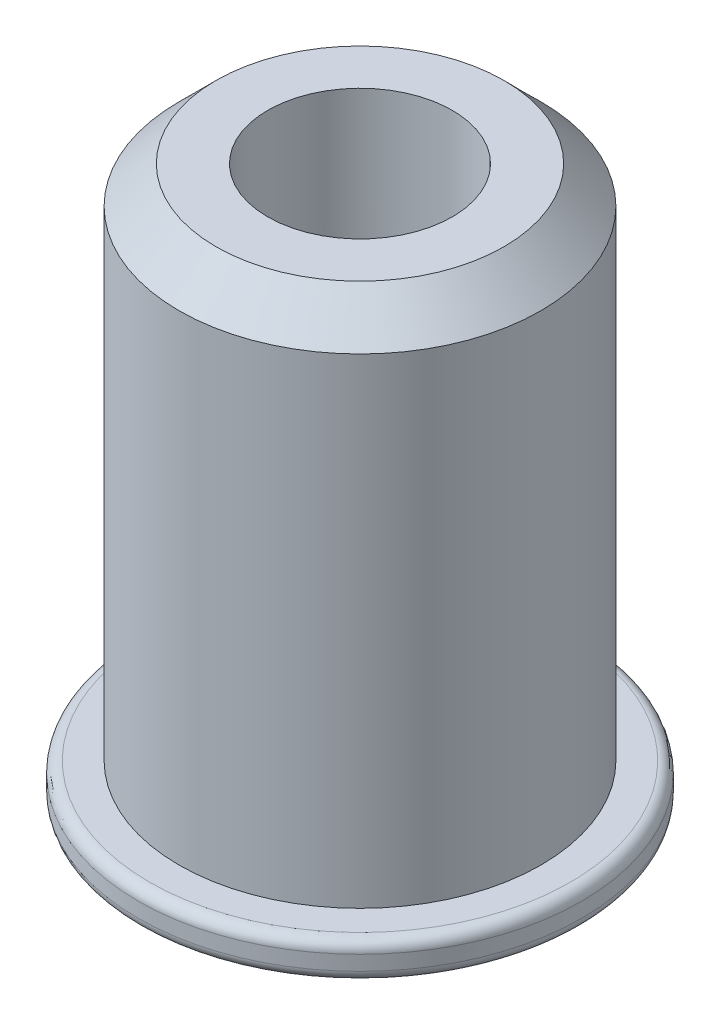
ISO-10303-21;
HEADER;
FILE_DESCRIPTION(('STEP AP214'),'2;1');
FILE_NAME('part.step','',(''),(''),'','','');
FILE_SCHEMA(('AUTOMOTIVE_DESIGN { 1 0 10303 214 1 1 1 1 }'));
ENDSEC;
DATA;
#1=APPLICATION_CONTEXT('core data for automotive mechanical design processes');
#2=APPLICATION_PROTOCOL_DEFINITION('international standard','automotive_design',2000,#1);
#3=PRODUCT_CONTEXT('',#1,'mechanical');
#4=PRODUCT('Part','Part','',(#3));
#5=PRODUCT_RELATED_PRODUCT_CATEGORY('part','',(#4));
#6=PRODUCT_DEFINITION_FORMATION('','',#4);
#7=PRODUCT_DEFINITION_CONTEXT('part definition',#1,'design');
#8=PRODUCT_DEFINITION('design','',#6,#7);
#9=PRODUCT_DEFINITION_SHAPE('','',#8);
#10=(LENGTH_UNIT() NAMED_UNIT(*) SI_UNIT(.MILLI.,.METRE.));
#11=(NAMED_UNIT(*) PLANE_ANGLE_UNIT() SI_UNIT($,.RADIAN.));
#12=(NAMED_UNIT(*) SI_UNIT($,.STERADIAN.) SOLID_ANGLE_UNIT());
#13=UNCERTAINTY_MEASURE_WITH_UNIT(LENGTH_MEASURE(1.E-05),#10,'distance_accuracy_value','');
#14=(GEOMETRIC_REPRESENTATION_CONTEXT(3) GLOBAL_UNCERTAINTY_ASSIGNED_CONTEXT((#13)) GLOBAL_UNIT_ASSIGNED_CONTEXT((#10,
#11,#12)) REPRESENTATION_CONTEXT('',''));
#15=CARTESIAN_POINT('',(0.,0.,0.));
#16=DIRECTION('',(0.,0.,1.));
#17=DIRECTION('',(1.,0.,0.));
#18=AXIS2_PLACEMENT_3D('',#15,#16,#17);
#19=CARTESIAN_POINT('',(-26.7512059231538,0.5,11.3386330935252));
#20=DIRECTION('',(0.,1.,0.));
#21=DIRECTION('',(0.,0.,1.));
#22=AXIS2_PLACEMENT_3D('',#19,#20,#21);
#23=PLANE('',#22);
#24=CARTESIAN_POINT('',(-26.7512059231538,0.5,11.3386330935252));
#25=DIRECTION('',(0.,1.,0.));
#26=DIRECTION('',(0.,0.,1.));
#27=AXIS2_PLACEMENT_3D('',#24,#25,#26);
#28=CIRCLE('',#27,2.85);
#29=CARTESIAN_POINT('',(-26.7512059231538,0.5,14.1886330935252));
#30=VERTEX_POINT('',#29);
#31=EDGE_CURVE('E44',#30,#30,#28,.T.);
#32=ORIENTED_EDGE('',*,*,#31,.T.);
#33=EDGE_LOOP('',(#32));
#34=FACE_BOUND('',#33,.T.);
#35=CARTESIAN_POINT('',(-26.7512059231538,0.5,11.3386330935252));
#36=DIRECTION('',(0.,1.,0.));
#37=DIRECTION('',(0.,0.,1.));
#38=AXIS2_PLACEMENT_3D('',#35,#36,#37);
#39=CIRCLE('',#38,2.45);
#40=CARTESIAN_POINT('',(-26.7512059231538,0.5,13.7886330935252));
#41=VERTEX_POINT('',#40);
#42=EDGE_CURVE('E70',#41,#41,#39,.T.);
#43=ORIENTED_EDGE('',*,*,#42,.F.);
#44=EDGE_LOOP('',(#43));
#45=FACE_BOUND('',#44,.T.);
#46=ADVANCED_FACE('F33',(#34,#45),#23,.T.);
#47=CARTESIAN_POINT('',(-26.7512059231538,0.5,11.3386330935252));
#48=DIRECTION('',(0.,-1.,0.));
#49=DIRECTION('',(0.,0.,-1.));
#50=AXIS2_PLACEMENT_3D('',#47,#48,#49);
#51=CYLINDRICAL_SURFACE('',#50,3.);
#52=CARTESIAN_POINT('',(-26.7512059231538,0.35,11.3386330935252));
#53=DIRECTION('',(0.,1.,0.));
#54=DIRECTION('',(0.,0.,1.));
#55=AXIS2_PLACEMENT_3D('',#52,#53,#54);
#56=CIRCLE('',#55,3.);
#57=CARTESIAN_POINT('',(-26.7512059231538,0.35,14.3386330935252));
#58=VERTEX_POINT('',#57);
#59=EDGE_CURVE('E10',#58,#58,#56,.F.);
#60=ORIENTED_EDGE('',*,*,#59,.T.);
#61=EDGE_LOOP('',(#60));
#62=FACE_BOUND('',#61,.T.);
#63=CARTESIAN_POINT('',(-26.7512059231538,0.15,11.3386330935252));
#64=DIRECTION('',(0.,1.,0.));
#65=DIRECTION('',(0.,0.,1.));
#66=AXIS2_PLACEMENT_3D('',#63,#64,#65);
#67=CIRCLE('',#66,3.);
#68=CARTESIAN_POINT('',(-26.7512059231538,0.15,14.3386330935252));
#69=VERTEX_POINT('',#68);
#70=EDGE_CURVE('E40',#69,#69,#67,.T.);
#71=ORIENTED_EDGE('',*,*,#70,.T.);
#72=EDGE_LOOP('',(#71));
#73=FACE_BOUND('',#72,.T.);
#74=ADVANCED_FACE('F102',(#62,#73),#51,.T.);
#75=CARTESIAN_POINT('',(-26.7512059231538,0.,11.3386330935252));
#76=DIRECTION('',(0.,1.,0.));
#77=DIRECTION('',(0.,0.,1.));
#78=AXIS2_PLACEMENT_3D('',#75,#76,#77);
#79=PLANE('',#78);
#80=CARTESIAN_POINT('',(-26.7512059231538,0.,11.3386330935252));
#81=DIRECTION('',(0.,1.,0.));
#82=DIRECTION('',(0.,0.,1.));
#83=AXIS2_PLACEMENT_3D('',#80,#81,#82);
#84=CIRCLE('',#83,2.1);
#85=CARTESIAN_POINT('',(-26.7512059231538,0.,13.4386330935252));
#86=VERTEX_POINT('',#85);
#87=EDGE_CURVE('E48',#86,#86,#84,.T.);
#88=ORIENTED_EDGE('',*,*,#87,.T.);
#89=EDGE_LOOP('',(#88));
#90=FACE_BOUND('',#89,.T.);
#91=CARTESIAN_POINT('',(-26.7512059231538,0.,11.3386330935252));
#92=DIRECTION('',(0.,1.,0.));
#93=DIRECTION('',(0.,0.,1.));
#94=AXIS2_PLACEMENT_3D('',#91,#92,#93);
#95=CIRCLE('',#94,2.85);
#96=CARTESIAN_POINT('',(-26.7512059231538,0.,14.1886330935252));
#97=VERTEX_POINT('',#96);
#98=EDGE_CURVE('E53',#97,#97,#95,.F.);
#99=ORIENTED_EDGE('',*,*,#98,.T.);
#100=EDGE_LOOP('',(#99));
#101=FACE_BOUND('',#100,.T.);
#102=ADVANCED_FACE('F108',(#90,#101),#79,.F.);
#103=CARTESIAN_POINT('',(-26.7512059231538,7.5,11.3386330935252));
#104=DIRECTION('',(0.,-1.,0.));
#105=DIRECTION('',(0.,0.,-1.));
#106=AXIS2_PLACEMENT_3D('',#103,#104,#105);
#107=CYLINDRICAL_SURFACE('',#106,2.45);
#108=CARTESIAN_POINT('',(-26.7512059231538,7.,11.3386330935252));
#109=DIRECTION('',(0.,1.,0.));
#110=DIRECTION('',(0.,0.,1.));
#111=AXIS2_PLACEMENT_3D('',#108,#109,#110);
#112=CIRCLE('',#111,2.45);
#113=CARTESIAN_POINT('',(-26.7512059231538,7.,13.7886330935252));
#114=VERTEX_POINT('',#113);
#115=EDGE_CURVE('E59',#114,#114,#112,.F.);
#116=ORIENTED_EDGE('',*,*,#115,.T.);
#117=EDGE_LOOP('',(#116));
#118=FACE_BOUND('',#117,.T.);
#119=ORIENTED_EDGE('',*,*,#42,.T.);
#120=EDGE_LOOP('',(#119));
#121=FACE_BOUND('',#120,.T.);
#122=ADVANCED_FACE('F84',(#118,#121),#107,.T.);
#123=CARTESIAN_POINT('',(-26.7512059231538,7.5,11.3386330935252));
#124=DIRECTION('',(0.,1.,0.));
#125=DIRECTION('',(0.,0.,1.));
#126=AXIS2_PLACEMENT_3D('',#123,#124,#125);
#127=PLANE('',#126);
#128=CARTESIAN_POINT('',(-26.7512059231538,7.5,11.3386330935252));
#129=DIRECTION('',(0.,1.,0.));
#130=DIRECTION('',(0.,0.,1.));
#131=AXIS2_PLACEMENT_3D('',#128,#129,#130);
#132=CIRCLE('',#131,1.25);
#133=CARTESIAN_POINT('',(-26.7512059231538,7.5,12.5886330935252));
#134=VERTEX_POINT('',#133);
#135=EDGE_CURVE('E64',#134,#134,#132,.T.);
#136=ORIENTED_EDGE('',*,*,#135,.F.);
#137=EDGE_LOOP('',(#136));
#138=FACE_BOUND('',#137,.T.);
#139=CARTESIAN_POINT('',(-26.7512059231538,7.5,11.3386330935252));
#140=DIRECTION('',(0.,1.,0.));
#141=DIRECTION('',(0.,0.,1.));
#142=AXIS2_PLACEMENT_3D('',#139,#140,#141);
#143=CIRCLE('',#142,1.95);
#144=CARTESIAN_POINT('',(-26.7512059231538,7.5,13.2886330935252));
#145=VERTEX_POINT('',#144);
#146=EDGE_CURVE('E67',#145,#145,#143,.T.);
#147=ORIENTED_EDGE('',*,*,#146,.T.);
#148=EDGE_LOOP('',(#147));
#149=FACE_BOUND('',#148,.T.);
#150=ADVANCED_FACE('F80',(#138,#149),#127,.T.);
#151=CARTESIAN_POINT('',(-26.7512059231538,7.5,11.3386330935252));
#152=DIRECTION('',(0.,-1.,0.));
#153=DIRECTION('',(0.,0.,-1.));
#154=AXIS2_PLACEMENT_3D('',#151,#152,#153);
#155=CONICAL_SURFACE('',#154,1.95,0.785398163397447);
#156=ORIENTED_EDGE('',*,*,#115,.F.);
#157=EDGE_LOOP('',(#156));
#158=FACE_BOUND('',#157,.T.);
#159=ORIENTED_EDGE('',*,*,#146,.F.);
#160=EDGE_LOOP('',(#159));
#161=FACE_BOUND('',#160,.T.);
#162=ADVANCED_FACE('F83',(#158,#161),#155,.T.);
#163=CARTESIAN_POINT('',(-26.7512059231538,2.,11.3386330935252));
#164=DIRECTION('',(0.,-1.,0.));
#165=DIRECTION('',(0.,0.,-1.));
#166=AXIS2_PLACEMENT_3D('',#163,#164,#165);
#167=CYLINDRICAL_SURFACE('',#166,1.95);
#168=CARTESIAN_POINT('',(-26.7512059231538,0.15,11.3386330935252));
#169=DIRECTION('',(0.,1.,0.));
#170=DIRECTION('',(0.,0.,1.));
#171=AXIS2_PLACEMENT_3D('',#168,#169,#170);
#172=CIRCLE('',#171,1.95);
#173=CARTESIAN_POINT('',(-26.7512059231538,0.15,13.2886330935252));
#174=VERTEX_POINT('',#173);
#175=EDGE_CURVE('E56',#174,#174,#172,.F.);
#176=ORIENTED_EDGE('',*,*,#175,.T.);
#177=EDGE_LOOP('',(#176));
#178=FACE_BOUND('',#177,.T.);
#179=CARTESIAN_POINT('',(-26.7512059231538,2.,11.3386330935252));
#180=DIRECTION('',(0.,-1.,0.));
#181=DIRECTION('',(0.,0.,-1.));
#182=AXIS2_PLACEMENT_3D('',#179,#180,#181);
#183=CIRCLE('',#182,1.95);
#184=CARTESIAN_POINT('',(-26.7512059231538,2.,9.38863309352518));
#185=VERTEX_POINT('',#184);
#186=EDGE_CURVE('E63',#185,#185,#183,.T.);
#187=ORIENTED_EDGE('',*,*,#186,.F.);
#188=EDGE_LOOP('',(#187));
#189=FACE_BOUND('',#188,.T.);
#190=ADVANCED_FACE('F89',(#178,#189),#167,.F.);
#191=CARTESIAN_POINT('',(-26.7512059231538,2.,11.3386330935252));
#192=DIRECTION('',(0.,-1.,0.));
#193=DIRECTION('',(0.,0.,-1.));
#194=AXIS2_PLACEMENT_3D('',#191,#192,#193);
#195=PLANE('',#194);
#196=CARTESIAN_POINT('',(-26.7512059231538,2.,11.3386330935252));
#197=DIRECTION('',(0.,-1.,0.));
#198=DIRECTION('',(0.,0.,-1.));
#199=AXIS2_PLACEMENT_3D('',#196,#197,#198);
#200=CIRCLE('',#199,1.25);
#201=CARTESIAN_POINT('',(-26.7512059231538,2.,10.0886330935252));
#202=VERTEX_POINT('',#201);
#203=EDGE_CURVE('E60',#202,#202,#200,.T.);
#204=ORIENTED_EDGE('',*,*,#203,.F.);
#205=EDGE_LOOP('',(#204));
#206=FACE_BOUND('',#205,.T.);
#207=ORIENTED_EDGE('',*,*,#186,.T.);
#208=EDGE_LOOP('',(#207));
#209=FACE_BOUND('',#208,.T.);
#210=ADVANCED_FACE('F95',(#206,#209),#195,.T.);
#211=CARTESIAN_POINT('',(-26.7512059231538,7.5,11.3386330935252));
#212=DIRECTION('',(0.,1.,0.));
#213=DIRECTION('',(0.,0.,1.));
#214=AXIS2_PLACEMENT_3D('',#211,#212,#213);
#215=CYLINDRICAL_SURFACE('',#214,1.25);
#216=ORIENTED_EDGE('',*,*,#203,.T.);
#217=EDGE_LOOP('',(#216));
#218=FACE_BOUND('',#217,.T.);
#219=ORIENTED_EDGE('',*,*,#135,.T.);
#220=EDGE_LOOP('',(#219));
#221=FACE_BOUND('',#220,.T.);
#222=ADVANCED_FACE('F78',(#218,#221),#215,.F.);
#223=CARTESIAN_POINT('',(-26.7512059231538,0.15,11.3386330935252));
#224=DIRECTION('',(0.,1.,0.));
#225=DIRECTION('',(0.,0.,1.));
#226=AXIS2_PLACEMENT_3D('',#223,#224,#225);
#227=TOROIDAL_SURFACE('',#226,2.1,0.15);
#228=ORIENTED_EDGE('',*,*,#87,.F.);
#229=EDGE_LOOP('',(#228));
#230=FACE_BOUND('',#229,.T.);
#231=ORIENTED_EDGE('',*,*,#175,.F.);
#232=EDGE_LOOP('',(#231));
#233=FACE_BOUND('',#232,.T.);
#234=ADVANCED_FACE('F128',(#230,#233),#227,.T.);
#235=CARTESIAN_POINT('',(-26.7512059231538,0.35,11.3386330935252));
#236=DIRECTION('',(0.,1.,0.));
#237=DIRECTION('',(0.,0.,1.));
#238=AXIS2_PLACEMENT_3D('',#235,#236,#237);
#239=TOROIDAL_SURFACE('',#238,2.85,0.15);
#240=ORIENTED_EDGE('',*,*,#59,.F.);
#241=EDGE_LOOP('',(#240));
#242=FACE_BOUND('',#241,.T.);
#243=ORIENTED_EDGE('',*,*,#31,.F.);
#244=EDGE_LOOP('',(#243));
#245=FACE_BOUND('',#244,.T.);
#246=ADVANCED_FACE('F124',(#242,#245),#239,.T.);
#247=CARTESIAN_POINT('',(-26.7512059231538,0.15,11.3386330935252));
#248=DIRECTION('',(0.,1.,0.));
#249=DIRECTION('',(0.,0.,1.));
#250=AXIS2_PLACEMENT_3D('',#247,#248,#249);
#251=TOROIDAL_SURFACE('',#250,2.85,0.15);
#252=ORIENTED_EDGE('',*,*,#98,.F.);
#253=EDGE_LOOP('',(#252));
#254=FACE_BOUND('',#253,.T.);
#255=ORIENTED_EDGE('',*,*,#70,.F.);
#256=EDGE_LOOP('',(#255));
#257=FACE_BOUND('',#256,.T.);
#258=ADVANCED_FACE('F35',(#254,#257),#251,.T.);
#259=CLOSED_SHELL('',(#46,#74,#102,#122,#150,#162,#190,#210,#222,#234,#246,#258));
#260=MANIFOLD_SOLID_BREP('B2',#259);
#261=ADVANCED_BREP_SHAPE_REPRESENTATION('',(#18,#260),#14);
#262=SHAPE_DEFINITION_REPRESENTATION(#9,#261);
ENDSEC;
END-ISO-10303-21;
